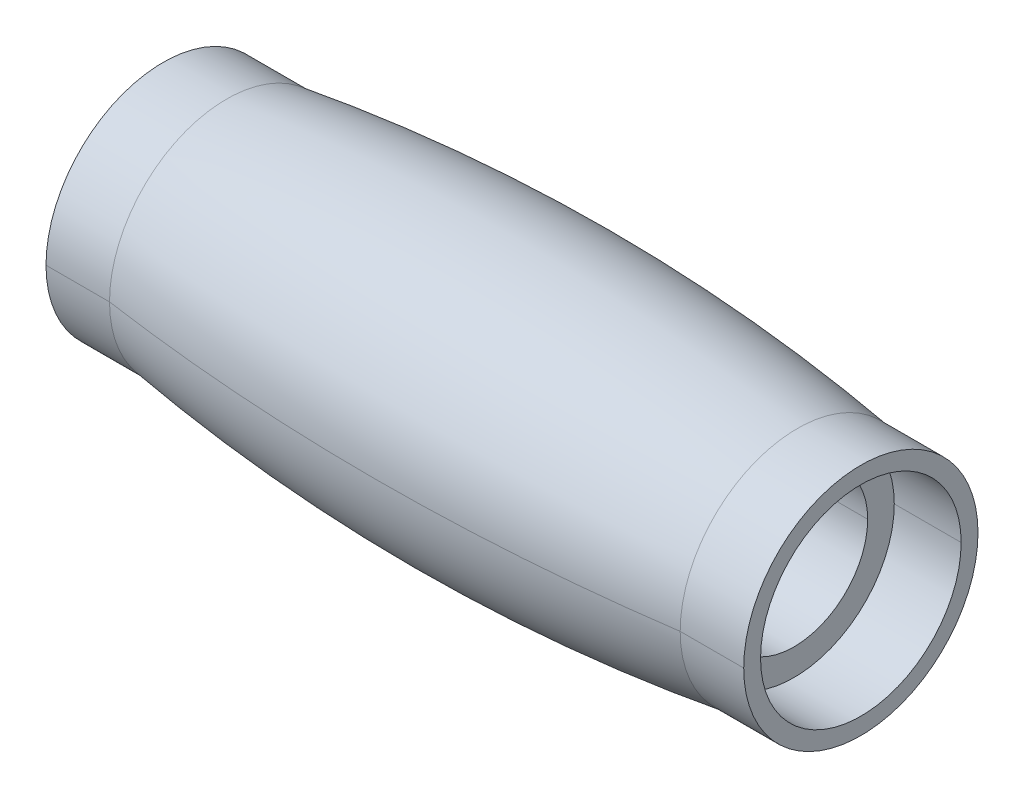
ISO-10303-21;
HEADER;
FILE_DESCRIPTION(('STEP AP214'),'2;1');
FILE_NAME('part.step','',(''),(''),'','','');
FILE_SCHEMA(('AUTOMOTIVE_DESIGN { 1 0 10303 214 1 1 1 1 }'));
ENDSEC;
DATA;
#1=APPLICATION_CONTEXT('core data for automotive mechanical design processes');
#2=APPLICATION_PROTOCOL_DEFINITION('international standard','automotive_design',2000,#1);
#3=PRODUCT_CONTEXT('',#1,'mechanical');
#4=PRODUCT('Part','Part','',(#3));
#5=PRODUCT_RELATED_PRODUCT_CATEGORY('part','',(#4));
#6=PRODUCT_DEFINITION_FORMATION('','',#4);
#7=PRODUCT_DEFINITION_CONTEXT('part definition',#1,'design');
#8=PRODUCT_DEFINITION('design','',#6,#7);
#9=PRODUCT_DEFINITION_SHAPE('','',#8);
#10=(LENGTH_UNIT() NAMED_UNIT(*) SI_UNIT(.MILLI.,.METRE.));
#11=(NAMED_UNIT(*) PLANE_ANGLE_UNIT() SI_UNIT($,.RADIAN.));
#12=(NAMED_UNIT(*) SI_UNIT($,.STERADIAN.) SOLID_ANGLE_UNIT());
#13=UNCERTAINTY_MEASURE_WITH_UNIT(LENGTH_MEASURE(1.E-05),#10,'distance_accuracy_value','');
#14=(GEOMETRIC_REPRESENTATION_CONTEXT(3) GLOBAL_UNCERTAINTY_ASSIGNED_CONTEXT((#13)) GLOBAL_UNIT_ASSIGNED_CONTEXT((#10,
#11,#12)) REPRESENTATION_CONTEXT('',''));
#15=CARTESIAN_POINT('',(0.,0.,0.));
#16=DIRECTION('',(0.,0.,1.));
#17=DIRECTION('',(1.,0.,0.));
#18=AXIS2_PLACEMENT_3D('',#15,#16,#17);
#19=CARTESIAN_POINT('',(13.38935,0.,0.));
#20=DIRECTION('',(-1.,0.,0.));
#21=DIRECTION('',(0.,0.,1.));
#22=AXIS2_PLACEMENT_3D('',#19,#20,#21);
#23=CYLINDRICAL_SURFACE('',#22,5.5626);
#24=DIRECTION('',(-1.,0.,0.));
#25=VECTOR('',#24,1.);
#26=CARTESIAN_POINT('',(13.38935,0.,-5.5626));
#27=LINE('',#26,#25);
#28=CARTESIAN_POINT('',(16.56435,0.,-5.5626));
#29=VERTEX_POINT('',#28);
#30=CARTESIAN_POINT('',(13.5485335660357,0.,-5.5626));
#31=VERTEX_POINT('',#30);
#32=EDGE_CURVE('E160',#29,#31,#27,.T.);
#33=ORIENTED_EDGE('',*,*,#32,.T.);
#34=CARTESIAN_POINT('',(13.5485335660357,0.,0.));
#35=DIRECTION('',(1.,0.,0.));
#36=DIRECTION('',(0.,0.,-1.));
#37=AXIS2_PLACEMENT_3D('',#34,#35,#36);
#38=CIRCLE('',#37,5.5626);
#39=CARTESIAN_POINT('',(13.5485335660357,0.,5.5626));
#40=VERTEX_POINT('',#39);
#41=EDGE_CURVE('E239',#31,#40,#38,.T.);
#42=ORIENTED_EDGE('',*,*,#41,.T.);
#43=DIRECTION('',(-1.,0.,0.));
#44=VECTOR('',#43,1.);
#45=CARTESIAN_POINT('',(13.38935,0.,5.5626));
#46=LINE('',#45,#44);
#47=CARTESIAN_POINT('',(16.56435,0.,5.5626));
#48=VERTEX_POINT('',#47);
#49=EDGE_CURVE('E165',#48,#40,#46,.T.);
#50=ORIENTED_EDGE('',*,*,#49,.F.);
#51=CARTESIAN_POINT('',(16.56435,0.,0.));
#52=DIRECTION('',(-1.,0.,0.));
#53=DIRECTION('',(0.,0.,1.));
#54=AXIS2_PLACEMENT_3D('',#51,#52,#53);
#55=CIRCLE('',#54,5.5626);
#56=EDGE_CURVE('E11',#48,#29,#55,.T.);
#57=ORIENTED_EDGE('',*,*,#56,.T.);
#58=EDGE_LOOP('',(#33,#42,#50,#57));
#59=FACE_BOUND('',#58,.T.);
#60=ADVANCED_FACE('F51',(#59),#23,.T.);
#61=CARTESIAN_POINT('',(-13.38935,0.,0.));
#62=DIRECTION('',(1.,0.,0.));
#63=DIRECTION('',(0.,0.,1.));
#64=AXIS2_PLACEMENT_3D('',#61,#62,#63);
#65=CYLINDRICAL_SURFACE('',#64,5.5626);
#66=DIRECTION('',(1.,0.,0.));
#67=VECTOR('',#66,1.);
#68=CARTESIAN_POINT('',(-13.38935,0.,-5.5626));
#69=LINE('',#68,#67);
#70=CARTESIAN_POINT('',(-16.56435,0.,-5.5626));
#71=VERTEX_POINT('',#70);
#72=CARTESIAN_POINT('',(-13.5485335660357,0.,-5.5626));
#73=VERTEX_POINT('',#72);
#74=EDGE_CURVE('E190',#71,#73,#69,.T.);
#75=ORIENTED_EDGE('',*,*,#74,.T.);
#76=CARTESIAN_POINT('',(-13.5485335660357,0.,0.));
#77=DIRECTION('',(-1.,0.,0.));
#78=DIRECTION('',(0.,0.,1.));
#79=AXIS2_PLACEMENT_3D('',#76,#77,#78);
#80=CIRCLE('',#79,5.5626);
#81=CARTESIAN_POINT('',(-13.5485335660357,0.,5.5626));
#82=VERTEX_POINT('',#81);
#83=EDGE_CURVE('E176',#73,#82,#80,.T.);
#84=ORIENTED_EDGE('',*,*,#83,.T.);
#85=DIRECTION('',(1.,0.,0.));
#86=VECTOR('',#85,1.);
#87=CARTESIAN_POINT('',(-13.38935,0.,5.5626));
#88=LINE('',#87,#86);
#89=CARTESIAN_POINT('',(-16.56435,0.,5.5626));
#90=VERTEX_POINT('',#89);
#91=EDGE_CURVE('E212',#90,#82,#88,.T.);
#92=ORIENTED_EDGE('',*,*,#91,.F.);
#93=CARTESIAN_POINT('',(-16.56435,0.,0.));
#94=DIRECTION('',(-1.,0.,0.));
#95=DIRECTION('',(0.,0.,1.));
#96=AXIS2_PLACEMENT_3D('',#93,#94,#95);
#97=CIRCLE('',#96,5.5626);
#98=EDGE_CURVE('E250',#71,#90,#97,.T.);
#99=ORIENTED_EDGE('',*,*,#98,.F.);
#100=EDGE_LOOP('',(#75,#84,#92,#99));
#101=FACE_BOUND('',#100,.T.);
#102=ADVANCED_FACE('F295',(#101),#65,.T.);
#103=CARTESIAN_POINT('',(16.56435,1.89605275924265E-12,0.));
#104=DIRECTION('',(1.,0.,0.));
#105=DIRECTION('',(0.,-1.,0.));
#106=AXIS2_PLACEMENT_3D('',#103,#104,#105);
#107=PLANE('',#106);
#108=CARTESIAN_POINT('',(16.56435,0.,0.));
#109=DIRECTION('',(1.,0.,0.));
#110=DIRECTION('',(0.,0.,-1.));
#111=AXIS2_PLACEMENT_3D('',#108,#109,#110);
#112=CIRCLE('',#111,4.7625);
#113=CARTESIAN_POINT('',(16.56435,0.,-4.7625));
#114=VERTEX_POINT('',#113);
#115=CARTESIAN_POINT('',(16.56435,0.,4.7625));
#116=VERTEX_POINT('',#115);
#117=EDGE_CURVE('E54',#114,#116,#112,.T.);
#118=ORIENTED_EDGE('',*,*,#117,.F.);
#119=CARTESIAN_POINT('',(16.56435,0.,0.));
#120=DIRECTION('',(1.,0.,0.));
#121=DIRECTION('',(0.,0.,-1.));
#122=AXIS2_PLACEMENT_3D('',#119,#120,#121);
#123=CIRCLE('',#122,4.7625);
#124=EDGE_CURVE('E196',#116,#114,#123,.T.);
#125=ORIENTED_EDGE('',*,*,#124,.F.);
#126=EDGE_LOOP('',(#118,#125));
#127=FACE_BOUND('',#126,.T.);
#128=ORIENTED_EDGE('',*,*,#56,.F.);
#129=CARTESIAN_POINT('',(16.56435,0.,0.));
#130=DIRECTION('',(-1.,0.,0.));
#131=DIRECTION('',(0.,0.,1.));
#132=AXIS2_PLACEMENT_3D('',#129,#130,#131);
#133=CIRCLE('',#132,5.5626);
#134=EDGE_CURVE('E153',#29,#48,#133,.T.);
#135=ORIENTED_EDGE('',*,*,#134,.F.);
#136=EDGE_LOOP('',(#128,#135));
#137=FACE_BOUND('',#136,.T.);
#138=ADVANCED_FACE('F154',(#127,#137),#107,.T.);
#139=CARTESIAN_POINT('',(-44.2462461036187,0.,0.));
#140=DIRECTION('',(-1.,0.,0.));
#141=DIRECTION('',(0.,0.,-1.));
#142=AXIS2_PLACEMENT_3D('',#139,#140,#141);
#143=CYLINDRICAL_SURFACE('',#142,4.7625);
#144=DIRECTION('',(-1.,0.,0.));
#145=VECTOR('',#144,1.);
#146=CARTESIAN_POINT('',(-44.2462461036187,0.,4.7625));
#147=LINE('',#146,#145);
#148=CARTESIAN_POINT('',(13.38935,0.,4.7625));
#149=VERTEX_POINT('',#148);
#150=EDGE_CURVE('E191',#116,#149,#147,.T.);
#151=ORIENTED_EDGE('',*,*,#150,.T.);
#152=CARTESIAN_POINT('',(13.38935,0.,0.));
#153=DIRECTION('',(1.,0.,0.));
#154=DIRECTION('',(0.,0.,-1.));
#155=AXIS2_PLACEMENT_3D('',#152,#153,#154);
#156=CIRCLE('',#155,4.7625);
#157=CARTESIAN_POINT('',(13.38935,0.,-4.7625));
#158=VERTEX_POINT('',#157);
#159=EDGE_CURVE('E185',#158,#149,#156,.T.);
#160=ORIENTED_EDGE('',*,*,#159,.F.);
#161=DIRECTION('',(-1.,0.,0.));
#162=VECTOR('',#161,1.);
#163=CARTESIAN_POINT('',(-44.2462461036187,0.,-4.7625));
#164=LINE('',#163,#162);
#165=EDGE_CURVE('E209',#114,#158,#164,.T.);
#166=ORIENTED_EDGE('',*,*,#165,.F.);
#167=ORIENTED_EDGE('',*,*,#117,.T.);
#168=EDGE_LOOP('',(#151,#160,#166,#167));
#169=FACE_BOUND('',#168,.T.);
#170=ADVANCED_FACE('F275',(#169),#143,.F.);
#171=CARTESIAN_POINT('',(13.38935,0.,0.));
#172=DIRECTION('',(1.,0.,0.));
#173=DIRECTION('',(0.,-1.,0.));
#174=AXIS2_PLACEMENT_3D('',#171,#172,#173);
#175=PLANE('',#174);
#176=CARTESIAN_POINT('',(13.38935,0.,0.));
#177=DIRECTION('',(1.,0.,0.));
#178=DIRECTION('',(0.,0.,-1.));
#179=AXIS2_PLACEMENT_3D('',#176,#177,#178);
#180=CIRCLE('',#179,3.5);
#181=CARTESIAN_POINT('',(13.38935,0.,-3.5));
#182=VERTEX_POINT('',#181);
#183=CARTESIAN_POINT('',(13.38935,0.,3.5));
#184=VERTEX_POINT('',#183);
#185=EDGE_CURVE('E182',#182,#184,#180,.T.);
#186=ORIENTED_EDGE('',*,*,#185,.F.);
#187=CARTESIAN_POINT('',(13.38935,0.,0.));
#188=DIRECTION('',(1.,0.,0.));
#189=DIRECTION('',(0.,0.,-1.));
#190=AXIS2_PLACEMENT_3D('',#187,#188,#189);
#191=CIRCLE('',#190,3.5);
#192=EDGE_CURVE('E216',#184,#182,#191,.T.);
#193=ORIENTED_EDGE('',*,*,#192,.F.);
#194=EDGE_LOOP('',(#186,#193));
#195=FACE_BOUND('',#194,.T.);
#196=ORIENTED_EDGE('',*,*,#159,.T.);
#197=CARTESIAN_POINT('',(13.38935,0.,0.));
#198=DIRECTION('',(1.,0.,0.));
#199=DIRECTION('',(0.,0.,-1.));
#200=AXIS2_PLACEMENT_3D('',#197,#198,#199);
#201=CIRCLE('',#200,4.7625);
#202=EDGE_CURVE('E195',#149,#158,#201,.T.);
#203=ORIENTED_EDGE('',*,*,#202,.T.);
#204=EDGE_LOOP('',(#196,#203));
#205=FACE_BOUND('',#204,.T.);
#206=ADVANCED_FACE('F280',(#195,#205),#175,.T.);
#207=CARTESIAN_POINT('',(-44.2462461036187,0.,0.));
#208=DIRECTION('',(-1.,0.,0.));
#209=DIRECTION('',(0.,0.,-1.));
#210=AXIS2_PLACEMENT_3D('',#207,#208,#209);
#211=CYLINDRICAL_SURFACE('',#210,3.5);
#212=DIRECTION('',(-1.,0.,0.));
#213=VECTOR('',#212,1.);
#214=CARTESIAN_POINT('',(-44.2462461036187,0.,3.5));
#215=LINE('',#214,#213);
#216=CARTESIAN_POINT('',(-13.38935,0.,3.5));
#217=VERTEX_POINT('',#216);
#218=EDGE_CURVE('E220',#184,#217,#215,.T.);
#219=ORIENTED_EDGE('',*,*,#218,.T.);
#220=CARTESIAN_POINT('',(-13.38935,0.,0.));
#221=DIRECTION('',(1.,0.,0.));
#222=DIRECTION('',(0.,0.,-1.));
#223=AXIS2_PLACEMENT_3D('',#220,#221,#222);
#224=CIRCLE('',#223,3.5);
#225=CARTESIAN_POINT('',(-13.38935,0.,-3.5));
#226=VERTEX_POINT('',#225);
#227=EDGE_CURVE('E186',#226,#217,#224,.T.);
#228=ORIENTED_EDGE('',*,*,#227,.F.);
#229=DIRECTION('',(-1.,0.,0.));
#230=VECTOR('',#229,1.);
#231=CARTESIAN_POINT('',(-44.2462461036187,0.,-3.49999999999996));
#232=LINE('',#231,#230);
#233=EDGE_CURVE('E197',#182,#226,#232,.T.);
#234=ORIENTED_EDGE('',*,*,#233,.F.);
#235=ORIENTED_EDGE('',*,*,#185,.T.);
#236=EDGE_LOOP('',(#219,#228,#234,#235));
#237=FACE_BOUND('',#236,.T.);
#238=ADVANCED_FACE('F282',(#237),#211,.F.);
#239=CARTESIAN_POINT('',(-13.38935,0.,0.));
#240=DIRECTION('',(1.,0.,0.));
#241=DIRECTION('',(0.,-1.,0.));
#242=AXIS2_PLACEMENT_3D('',#239,#240,#241);
#243=PLANE('',#242);
#244=ORIENTED_EDGE('',*,*,#227,.T.);
#245=CARTESIAN_POINT('',(-13.38935,0.,0.));
#246=DIRECTION('',(1.,0.,0.));
#247=DIRECTION('',(0.,0.,-1.));
#248=AXIS2_PLACEMENT_3D('',#245,#246,#247);
#249=CIRCLE('',#248,3.5);
#250=EDGE_CURVE('E202',#217,#226,#249,.T.);
#251=ORIENTED_EDGE('',*,*,#250,.T.);
#252=EDGE_LOOP('',(#244,#251));
#253=FACE_BOUND('',#252,.T.);
#254=CARTESIAN_POINT('',(-13.38935,0.,0.));
#255=DIRECTION('',(1.,0.,0.));
#256=DIRECTION('',(0.,0.,-1.));
#257=AXIS2_PLACEMENT_3D('',#254,#255,#256);
#258=CIRCLE('',#257,4.7625);
#259=CARTESIAN_POINT('',(-13.38935,0.,-4.7625));
#260=VERTEX_POINT('',#259);
#261=CARTESIAN_POINT('',(-13.38935,0.,4.7625));
#262=VERTEX_POINT('',#261);
#263=EDGE_CURVE('E257',#260,#262,#258,.T.);
#264=ORIENTED_EDGE('',*,*,#263,.F.);
#265=CARTESIAN_POINT('',(-13.38935,0.,0.));
#266=DIRECTION('',(1.,0.,0.));
#267=DIRECTION('',(0.,0.,-1.));
#268=AXIS2_PLACEMENT_3D('',#265,#266,#267);
#269=CIRCLE('',#268,4.7625);
#270=EDGE_CURVE('E201',#262,#260,#269,.T.);
#271=ORIENTED_EDGE('',*,*,#270,.F.);
#272=EDGE_LOOP('',(#264,#271));
#273=FACE_BOUND('',#272,.T.);
#274=ADVANCED_FACE('F288',(#253,#273),#243,.F.);
#275=CARTESIAN_POINT('',(-44.2462461036187,0.,0.));
#276=DIRECTION('',(-1.,0.,0.));
#277=DIRECTION('',(0.,0.,-1.));
#278=AXIS2_PLACEMENT_3D('',#275,#276,#277);
#279=CYLINDRICAL_SURFACE('',#278,4.7625);
#280=DIRECTION('',(-1.,0.,0.));
#281=VECTOR('',#280,1.);
#282=CARTESIAN_POINT('',(-44.2462461036187,0.,4.7625));
#283=LINE('',#282,#281);
#284=CARTESIAN_POINT('',(-16.56435,0.,4.7625));
#285=VERTEX_POINT('',#284);
#286=EDGE_CURVE('E230',#262,#285,#283,.T.);
#287=ORIENTED_EDGE('',*,*,#286,.T.);
#288=CARTESIAN_POINT('',(-16.56435,0.,0.));
#289=DIRECTION('',(1.,0.,0.));
#290=DIRECTION('',(0.,0.,-1.));
#291=AXIS2_PLACEMENT_3D('',#288,#289,#290);
#292=CIRCLE('',#291,4.7625);
#293=CARTESIAN_POINT('',(-16.56435,0.,-4.7625));
#294=VERTEX_POINT('',#293);
#295=EDGE_CURVE('E254',#294,#285,#292,.T.);
#296=ORIENTED_EDGE('',*,*,#295,.F.);
#297=DIRECTION('',(-1.,0.,0.));
#298=VECTOR('',#297,1.);
#299=CARTESIAN_POINT('',(-44.2462461036187,0.,-4.7625));
#300=LINE('',#299,#298);
#301=EDGE_CURVE('E236',#260,#294,#300,.T.);
#302=ORIENTED_EDGE('',*,*,#301,.F.);
#303=ORIENTED_EDGE('',*,*,#263,.T.);
#304=EDGE_LOOP('',(#287,#296,#302,#303));
#305=FACE_BOUND('',#304,.T.);
#306=ADVANCED_FACE('F312',(#305),#279,.F.);
#307=CARTESIAN_POINT('',(-16.56435,1.90906318531247E-12,0.));
#308=DIRECTION('',(1.,0.,0.));
#309=DIRECTION('',(0.,-1.,0.));
#310=AXIS2_PLACEMENT_3D('',#307,#308,#309);
#311=PLANE('',#310);
#312=ORIENTED_EDGE('',*,*,#295,.T.);
#313=CARTESIAN_POINT('',(-16.56435,0.,0.));
#314=DIRECTION('',(1.,0.,0.));
#315=DIRECTION('',(0.,0.,-1.));
#316=AXIS2_PLACEMENT_3D('',#313,#314,#315);
#317=CIRCLE('',#316,4.7625);
#318=EDGE_CURVE('E71',#285,#294,#317,.T.);
#319=ORIENTED_EDGE('',*,*,#318,.T.);
#320=EDGE_LOOP('',(#312,#319));
#321=FACE_BOUND('',#320,.T.);
#322=CARTESIAN_POINT('',(-16.56435,0.,0.));
#323=DIRECTION('',(-1.,0.,0.));
#324=DIRECTION('',(0.,0.,1.));
#325=AXIS2_PLACEMENT_3D('',#322,#323,#324);
#326=CIRCLE('',#325,5.5626);
#327=EDGE_CURVE('E181',#90,#71,#326,.T.);
#328=ORIENTED_EDGE('',*,*,#327,.T.);
#329=ORIENTED_EDGE('',*,*,#98,.T.);
#330=EDGE_LOOP('',(#328,#329));
#331=FACE_BOUND('',#330,.T.);
#332=ADVANCED_FACE('F309',(#321,#331),#311,.F.);
#333=CARTESIAN_POINT('',(0.,0.,0.));
#334=DIRECTION('',(-1.,0.,0.));
#335=DIRECTION('',(0.,0.,1.));
#336=AXIS2_PLACEMENT_3D('',#333,#334,#335);
#337=DEGENERATE_TOROIDAL_SURFACE('',#336,87.8040394213596,94.3445394213581,.F.);
#338=CARTESIAN_POINT('',(0.,0.,-87.8040394213596));
#339=DIRECTION('',(0.,-1.,0.));
#340=DIRECTION('',(0.,0.,-1.));
#341=AXIS2_PLACEMENT_3D('',#338,#339,#340);
#342=CIRCLE('',#341,94.3445394213581);
#343=EDGE_CURVE('E242',#40,#82,#342,.T.);
#344=ORIENTED_EDGE('',*,*,#343,.T.);
#345=ORIENTED_EDGE('',*,*,#83,.F.);
#346=CARTESIAN_POINT('',(0.,0.,87.8040394213596));
#347=DIRECTION('',(0.,1.,0.));
#348=DIRECTION('',(0.,0.,1.));
#349=AXIS2_PLACEMENT_3D('',#346,#347,#348);
#350=CIRCLE('',#349,94.3445394213581);
#351=EDGE_CURVE('E245',#31,#73,#350,.T.);
#352=ORIENTED_EDGE('',*,*,#351,.F.);
#353=CARTESIAN_POINT('',(13.5485335660357,0.,0.));
#354=DIRECTION('',(1.,0.,0.));
#355=DIRECTION('',(0.,0.,-1.));
#356=AXIS2_PLACEMENT_3D('',#353,#354,#355);
#357=CIRCLE('',#356,5.5626);
#358=EDGE_CURVE('E167',#40,#31,#357,.T.);
#359=ORIENTED_EDGE('',*,*,#358,.F.);
#360=EDGE_LOOP('',(#344,#345,#352,#359));
#361=FACE_BOUND('',#360,.T.);
#362=ADVANCED_FACE('F311',(#361),#337,.F.);
#363=CARTESIAN_POINT('',(0.,0.,0.));
#364=DIRECTION('',(-1.,0.,0.));
#365=DIRECTION('',(0.,0.,1.));
#366=AXIS2_PLACEMENT_3D('',#363,#364,#365);
#367=DEGENERATE_TOROIDAL_SURFACE('',#366,87.8040394213596,94.3445394213581,.F.);
#368=ORIENTED_EDGE('',*,*,#41,.F.);
#369=ORIENTED_EDGE('',*,*,#351,.T.);
#370=CARTESIAN_POINT('',(-13.5485335660357,0.,0.));
#371=DIRECTION('',(-1.,0.,0.));
#372=DIRECTION('',(0.,0.,1.));
#373=AXIS2_PLACEMENT_3D('',#370,#371,#372);
#374=CIRCLE('',#373,5.5626);
#375=EDGE_CURVE('E206',#82,#73,#374,.T.);
#376=ORIENTED_EDGE('',*,*,#375,.F.);
#377=ORIENTED_EDGE('',*,*,#343,.F.);
#378=EDGE_LOOP('',(#368,#369,#376,#377));
#379=FACE_BOUND('',#378,.T.);
#380=ADVANCED_FACE('F307',(#379),#367,.F.);
#381=CARTESIAN_POINT('',(-44.2462461036187,0.,0.));
#382=DIRECTION('',(-1.,0.,0.));
#383=DIRECTION('',(0.,0.,-1.));
#384=AXIS2_PLACEMENT_3D('',#381,#382,#383);
#385=CYLINDRICAL_SURFACE('',#384,4.7625);
#386=ORIENTED_EDGE('',*,*,#270,.T.);
#387=ORIENTED_EDGE('',*,*,#301,.T.);
#388=ORIENTED_EDGE('',*,*,#318,.F.);
#389=ORIENTED_EDGE('',*,*,#286,.F.);
#390=EDGE_LOOP('',(#386,#387,#388,#389));
#391=FACE_BOUND('',#390,.T.);
#392=ADVANCED_FACE('F323',(#391),#385,.F.);
#393=CARTESIAN_POINT('',(-44.2462461036187,0.,0.));
#394=DIRECTION('',(-1.,0.,0.));
#395=DIRECTION('',(0.,0.,-1.));
#396=AXIS2_PLACEMENT_3D('',#393,#394,#395);
#397=CYLINDRICAL_SURFACE('',#396,3.5);
#398=ORIENTED_EDGE('',*,*,#192,.T.);
#399=ORIENTED_EDGE('',*,*,#233,.T.);
#400=ORIENTED_EDGE('',*,*,#250,.F.);
#401=ORIENTED_EDGE('',*,*,#218,.F.);
#402=EDGE_LOOP('',(#398,#399,#400,#401));
#403=FACE_BOUND('',#402,.T.);
#404=ADVANCED_FACE('F326',(#403),#397,.F.);
#405=CARTESIAN_POINT('',(-44.2462461036187,0.,0.));
#406=DIRECTION('',(-1.,0.,0.));
#407=DIRECTION('',(0.,0.,-1.));
#408=AXIS2_PLACEMENT_3D('',#405,#406,#407);
#409=CYLINDRICAL_SURFACE('',#408,4.7625);
#410=ORIENTED_EDGE('',*,*,#124,.T.);
#411=ORIENTED_EDGE('',*,*,#165,.T.);
#412=ORIENTED_EDGE('',*,*,#202,.F.);
#413=ORIENTED_EDGE('',*,*,#150,.F.);
#414=EDGE_LOOP('',(#410,#411,#412,#413));
#415=FACE_BOUND('',#414,.T.);
#416=ADVANCED_FACE('F279',(#415),#409,.F.);
#417=CARTESIAN_POINT('',(-13.38935,0.,0.));
#418=DIRECTION('',(1.,0.,0.));
#419=DIRECTION('',(0.,0.,1.));
#420=AXIS2_PLACEMENT_3D('',#417,#418,#419);
#421=CYLINDRICAL_SURFACE('',#420,5.5626);
#422=ORIENTED_EDGE('',*,*,#327,.F.);
#423=ORIENTED_EDGE('',*,*,#91,.T.);
#424=ORIENTED_EDGE('',*,*,#375,.T.);
#425=ORIENTED_EDGE('',*,*,#74,.F.);
#426=EDGE_LOOP('',(#422,#423,#424,#425));
#427=FACE_BOUND('',#426,.T.);
#428=ADVANCED_FACE('F337',(#427),#421,.T.);
#429=CARTESIAN_POINT('',(13.38935,0.,0.));
#430=DIRECTION('',(-1.,0.,0.));
#431=DIRECTION('',(0.,0.,1.));
#432=AXIS2_PLACEMENT_3D('',#429,#430,#431);
#433=CYLINDRICAL_SURFACE('',#432,5.5626);
#434=ORIENTED_EDGE('',*,*,#134,.T.);
#435=ORIENTED_EDGE('',*,*,#49,.T.);
#436=ORIENTED_EDGE('',*,*,#358,.T.);
#437=ORIENTED_EDGE('',*,*,#32,.F.);
#438=EDGE_LOOP('',(#434,#435,#436,#437));
#439=FACE_BOUND('',#438,.T.);
#440=ADVANCED_FACE('F166',(#439),#433,.T.);
#441=CLOSED_SHELL('',(#60,#102,#138,#170,#206,#238,#274,#306,#332,#362,#380,#392,#404,#416,#428,#440));
#442=MANIFOLD_SOLID_BREP('B2',#441);
#443=ADVANCED_BREP_SHAPE_REPRESENTATION('',(#18,#442),#14);
#444=SHAPE_DEFINITION_REPRESENTATION(#9,#443);
ENDSEC;
END-ISO-10303-21;
